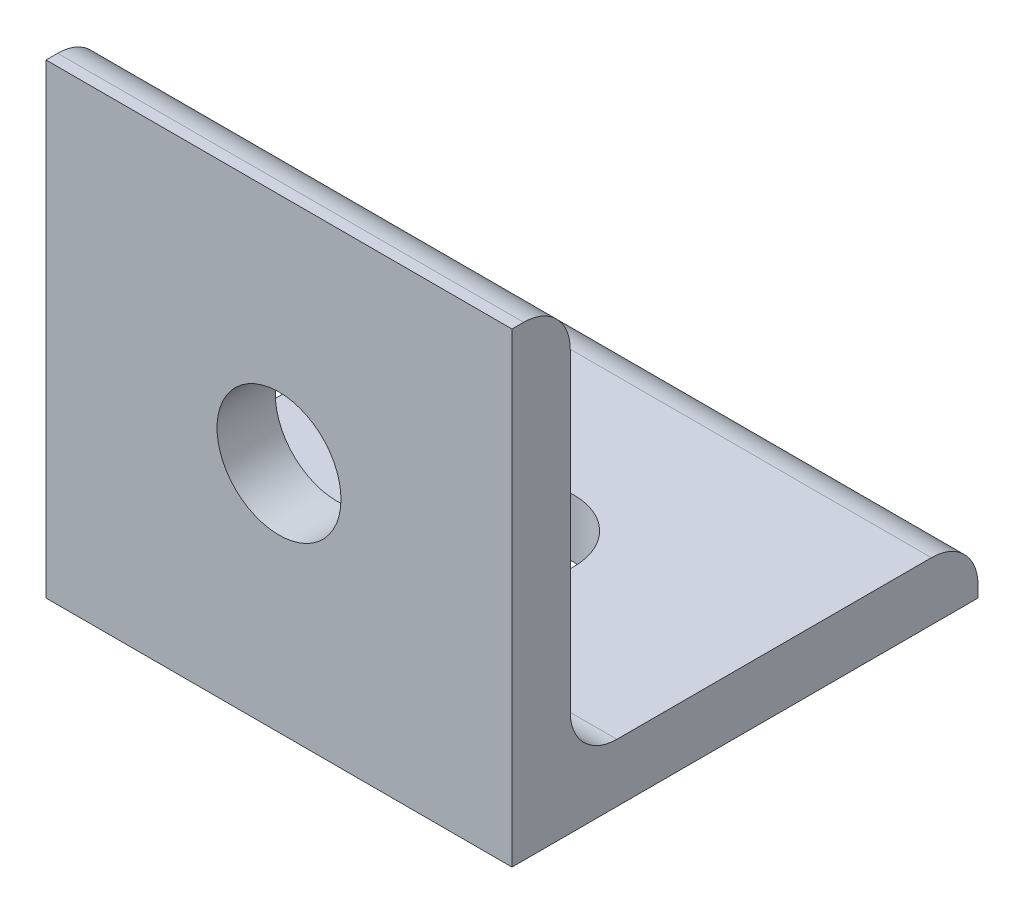
ISO-10303-21;
HEADER;
FILE_DESCRIPTION(('STEP AP214'),'2;1');
FILE_NAME('part.step','',(''),(''),'','','');
FILE_SCHEMA(('AUTOMOTIVE_DESIGN { 1 0 10303 214 1 1 1 1 }'));
ENDSEC;
DATA;
#1=APPLICATION_CONTEXT('core data for automotive mechanical design processes');
#2=APPLICATION_PROTOCOL_DEFINITION('international standard','automotive_design',2000,#1);
#3=PRODUCT_CONTEXT('',#1,'mechanical');
#4=PRODUCT('Part','Part','',(#3));
#5=PRODUCT_RELATED_PRODUCT_CATEGORY('part','',(#4));
#6=PRODUCT_DEFINITION_FORMATION('','',#4);
#7=PRODUCT_DEFINITION_CONTEXT('part definition',#1,'design');
#8=PRODUCT_DEFINITION('design','',#6,#7);
#9=PRODUCT_DEFINITION_SHAPE('','',#8);
#10=(LENGTH_UNIT() NAMED_UNIT(*) SI_UNIT(.MILLI.,.METRE.));
#11=(NAMED_UNIT(*) PLANE_ANGLE_UNIT() SI_UNIT($,.RADIAN.));
#12=(NAMED_UNIT(*) SI_UNIT($,.STERADIAN.) SOLID_ANGLE_UNIT());
#13=UNCERTAINTY_MEASURE_WITH_UNIT(LENGTH_MEASURE(1.E-05),#10,'distance_accuracy_value','');
#14=(GEOMETRIC_REPRESENTATION_CONTEXT(3) GLOBAL_UNCERTAINTY_ASSIGNED_CONTEXT((#13)) GLOBAL_UNIT_ASSIGNED_CONTEXT((#10,
#11,#12)) REPRESENTATION_CONTEXT('',''));
#15=CARTESIAN_POINT('',(0.,0.,0.));
#16=DIRECTION('',(0.,0.,1.));
#17=DIRECTION('',(1.,0.,0.));
#18=AXIS2_PLACEMENT_3D('',#15,#16,#17);
#19=CARTESIAN_POINT('',(12.7,0.,-25.4));
#20=DIRECTION('',(0.,1.,0.));
#21=DIRECTION('',(0.,0.,1.));
#22=AXIS2_PLACEMENT_3D('',#19,#20,#21);
#23=PLANE('',#22);
#24=CARTESIAN_POINT('',(0.,0.,-12.7));
#25=DIRECTION('',(0.,-1.,0.));
#26=DIRECTION('',(0.,0.,-1.));
#27=AXIS2_PLACEMENT_3D('',#24,#25,#26);
#28=CIRCLE('',#27,3.37819999999999);
#29=CARTESIAN_POINT('',(0.,0.,-16.0782));
#30=VERTEX_POINT('',#29);
#31=EDGE_CURVE('E240',#30,#30,#28,.T.);
#32=ORIENTED_EDGE('',*,*,#31,.F.);
#33=EDGE_LOOP('',(#32));
#34=FACE_BOUND('',#33,.T.);
#35=DIRECTION('',(0.,0.,-1.));
#36=VECTOR('',#35,1.);
#37=CARTESIAN_POINT('',(-12.7,0.,-25.4));
#38=LINE('',#37,#36);
#39=CARTESIAN_POINT('',(-12.7,0.,0.));
#40=VERTEX_POINT('',#39);
#41=CARTESIAN_POINT('',(-12.7,0.,-25.4));
#42=VERTEX_POINT('',#41);
#43=EDGE_CURVE('E122',#40,#42,#38,.T.);
#44=ORIENTED_EDGE('',*,*,#43,.T.);
#45=DIRECTION('',(-1.,0.,0.));
#46=VECTOR('',#45,1.);
#47=CARTESIAN_POINT('',(12.7,0.,-25.4));
#48=LINE('',#47,#46);
#49=CARTESIAN_POINT('',(12.7,0.,-25.4));
#50=VERTEX_POINT('',#49);
#51=EDGE_CURVE('E106',#50,#42,#48,.T.);
#52=ORIENTED_EDGE('',*,*,#51,.F.);
#53=DIRECTION('',(0.,0.,-1.));
#54=VECTOR('',#53,1.);
#55=CARTESIAN_POINT('',(12.7,0.,-25.4));
#56=LINE('',#55,#54);
#57=CARTESIAN_POINT('',(12.7,0.,0.));
#58=VERTEX_POINT('',#57);
#59=EDGE_CURVE('E110',#58,#50,#56,.T.);
#60=ORIENTED_EDGE('',*,*,#59,.F.);
#61=DIRECTION('',(-1.,0.,0.));
#62=VECTOR('',#61,1.);
#63=CARTESIAN_POINT('',(12.7,0.,0.));
#64=LINE('',#63,#62);
#65=EDGE_CURVE('E129',#58,#40,#64,.T.);
#66=ORIENTED_EDGE('',*,*,#65,.T.);
#67=EDGE_LOOP('',(#44,#52,#60,#66));
#68=FACE_BOUND('',#67,.T.);
#69=ADVANCED_FACE('F32',(#34,#68),#23,.F.);
#70=CARTESIAN_POINT('',(12.7,3.175,-25.4));
#71=DIRECTION('',(0.,0.,1.));
#72=DIRECTION('',(1.,0.,0.));
#73=AXIS2_PLACEMENT_3D('',#70,#71,#72);
#74=PLANE('',#73);
#75=DIRECTION('',(0.,1.,0.));
#76=VECTOR('',#75,1.);
#77=CARTESIAN_POINT('',(-12.7,3.175,-25.4));
#78=LINE('',#77,#76);
#79=CARTESIAN_POINT('',(-12.7,0.634999999999998,-25.4));
#80=VERTEX_POINT('',#79);
#81=EDGE_CURVE('E166',#42,#80,#78,.T.);
#82=ORIENTED_EDGE('',*,*,#81,.T.);
#83=DIRECTION('',(-1.,0.,0.));
#84=VECTOR('',#83,1.);
#85=CARTESIAN_POINT('',(12.7,0.634999999999998,-25.4));
#86=LINE('',#85,#84);
#87=CARTESIAN_POINT('',(12.7,0.634999999999998,-25.4));
#88=VERTEX_POINT('',#87);
#89=EDGE_CURVE('E55',#80,#88,#86,.F.);
#90=ORIENTED_EDGE('',*,*,#89,.T.);
#91=DIRECTION('',(0.,1.,0.));
#92=VECTOR('',#91,1.);
#93=CARTESIAN_POINT('',(12.7,3.175,-25.4));
#94=LINE('',#93,#92);
#95=EDGE_CURVE('E102',#50,#88,#94,.T.);
#96=ORIENTED_EDGE('',*,*,#95,.F.);
#97=ORIENTED_EDGE('',*,*,#51,.T.);
#98=EDGE_LOOP('',(#82,#90,#96,#97));
#99=FACE_BOUND('',#98,.T.);
#100=ADVANCED_FACE('F104',(#99),#74,.F.);
#101=CARTESIAN_POINT('',(12.7,3.175,-3.175));
#102=DIRECTION('',(0.,-1.,0.));
#103=DIRECTION('',(0.,0.,-1.));
#104=AXIS2_PLACEMENT_3D('',#101,#102,#103);
#105=PLANE('',#104);
#106=CARTESIAN_POINT('',(0.,3.175,-12.7));
#107=DIRECTION('',(0.,-1.,0.));
#108=DIRECTION('',(0.,0.,-1.));
#109=AXIS2_PLACEMENT_3D('',#106,#107,#108);
#110=CIRCLE('',#109,3.37819999999999);
#111=CARTESIAN_POINT('',(0.,3.175,-16.0782));
#112=VERTEX_POINT('',#111);
#113=EDGE_CURVE('E238',#112,#112,#110,.T.);
#114=ORIENTED_EDGE('',*,*,#113,.T.);
#115=EDGE_LOOP('',(#114));
#116=FACE_BOUND('',#115,.T.);
#117=DIRECTION('',(0.,0.,1.));
#118=VECTOR('',#117,1.);
#119=CARTESIAN_POINT('',(-12.7,3.175,-3.175));
#120=LINE('',#119,#118);
#121=CARTESIAN_POINT('',(-12.7,3.175,-22.86));
#122=VERTEX_POINT('',#121);
#123=CARTESIAN_POINT('',(-12.7,3.175,-5.715));
#124=VERTEX_POINT('',#123);
#125=EDGE_CURVE('E155',#122,#124,#120,.T.);
#126=ORIENTED_EDGE('',*,*,#125,.T.);
#127=DIRECTION('',(-1.,0.,0.));
#128=VECTOR('',#127,1.);
#129=CARTESIAN_POINT('',(12.7,3.175,-5.715));
#130=LINE('',#129,#128);
#131=CARTESIAN_POINT('',(12.7,3.175,-5.715));
#132=VERTEX_POINT('',#131);
#133=EDGE_CURVE('E138',#124,#132,#130,.F.);
#134=ORIENTED_EDGE('',*,*,#133,.T.);
#135=DIRECTION('',(0.,0.,1.));
#136=VECTOR('',#135,1.);
#137=CARTESIAN_POINT('',(12.7,3.175,-3.175));
#138=LINE('',#137,#136);
#139=CARTESIAN_POINT('',(12.7,3.175,-22.86));
#140=VERTEX_POINT('',#139);
#141=EDGE_CURVE('E109',#140,#132,#138,.T.);
#142=ORIENTED_EDGE('',*,*,#141,.F.);
#143=DIRECTION('',(-1.,0.,0.));
#144=VECTOR('',#143,1.);
#145=CARTESIAN_POINT('',(12.7,3.175,-22.86));
#146=LINE('',#145,#144);
#147=EDGE_CURVE('E135',#140,#122,#146,.T.);
#148=ORIENTED_EDGE('',*,*,#147,.T.);
#149=EDGE_LOOP('',(#126,#134,#142,#148));
#150=FACE_BOUND('',#149,.T.);
#151=ADVANCED_FACE('F162',(#116,#150),#105,.F.);
#152=CARTESIAN_POINT('',(12.7,25.4,-3.175));
#153=DIRECTION('',(0.,0.,1.));
#154=DIRECTION('',(0.,-1.,0.));
#155=AXIS2_PLACEMENT_3D('',#152,#153,#154);
#156=PLANE('',#155);
#157=CARTESIAN_POINT('',(0.,12.7,-3.175));
#158=DIRECTION('',(0.,0.,1.));
#159=DIRECTION('',(0.,-1.,0.));
#160=AXIS2_PLACEMENT_3D('',#157,#158,#159);
#161=CIRCLE('',#160,3.37819999999999);
#162=CARTESIAN_POINT('',(0.,9.3218,-3.175));
#163=VERTEX_POINT('',#162);
#164=EDGE_CURVE('E182',#163,#163,#161,.T.);
#165=ORIENTED_EDGE('',*,*,#164,.T.);
#166=EDGE_LOOP('',(#165));
#167=FACE_BOUND('',#166,.T.);
#168=DIRECTION('',(0.,1.,0.));
#169=VECTOR('',#168,1.);
#170=CARTESIAN_POINT('',(12.7,25.4,-3.175));
#171=LINE('',#170,#169);
#172=CARTESIAN_POINT('',(12.7,5.715,-3.175));
#173=VERTEX_POINT('',#172);
#174=CARTESIAN_POINT('',(12.7,22.86,-3.175));
#175=VERTEX_POINT('',#174);
#176=EDGE_CURVE('E171',#173,#175,#171,.T.);
#177=ORIENTED_EDGE('',*,*,#176,.F.);
#178=DIRECTION('',(-1.,0.,0.));
#179=VECTOR('',#178,1.);
#180=CARTESIAN_POINT('',(-12.7,5.715,-3.175));
#181=LINE('',#180,#179);
#182=CARTESIAN_POINT('',(-12.7,5.715,-3.175));
#183=VERTEX_POINT('',#182);
#184=EDGE_CURVE('E126',#173,#183,#181,.T.);
#185=ORIENTED_EDGE('',*,*,#184,.T.);
#186=DIRECTION('',(0.,1.,0.));
#187=VECTOR('',#186,1.);
#188=CARTESIAN_POINT('',(-12.7,25.4,-3.175));
#189=LINE('',#188,#187);
#190=CARTESIAN_POINT('',(-12.7,22.86,-3.175));
#191=VERTEX_POINT('',#190);
#192=EDGE_CURVE('E157',#183,#191,#189,.T.);
#193=ORIENTED_EDGE('',*,*,#192,.T.);
#194=DIRECTION('',(-1.,0.,0.));
#195=VECTOR('',#194,1.);
#196=CARTESIAN_POINT('',(12.7,22.86,-3.175));
#197=LINE('',#196,#195);
#198=EDGE_CURVE('E123',#191,#175,#197,.F.);
#199=ORIENTED_EDGE('',*,*,#198,.T.);
#200=EDGE_LOOP('',(#177,#185,#193,#199));
#201=FACE_BOUND('',#200,.T.);
#202=ADVANCED_FACE('F173',(#167,#201),#156,.F.);
#203=CARTESIAN_POINT('',(12.7,25.4,0.));
#204=DIRECTION('',(0.,-1.,0.));
#205=DIRECTION('',(0.,0.,-1.));
#206=AXIS2_PLACEMENT_3D('',#203,#204,#205);
#207=PLANE('',#206);
#208=DIRECTION('',(0.,0.,1.));
#209=VECTOR('',#208,1.);
#210=CARTESIAN_POINT('',(12.7,25.4,0.));
#211=LINE('',#210,#209);
#212=CARTESIAN_POINT('',(12.7,25.4,-0.635));
#213=VERTEX_POINT('',#212);
#214=CARTESIAN_POINT('',(12.7,25.4,0.));
#215=VERTEX_POINT('',#214);
#216=EDGE_CURVE('E175',#213,#215,#211,.T.);
#217=ORIENTED_EDGE('',*,*,#216,.F.);
#218=DIRECTION('',(-1.,0.,0.));
#219=VECTOR('',#218,1.);
#220=CARTESIAN_POINT('',(12.7,25.4,-0.635));
#221=LINE('',#220,#219);
#222=CARTESIAN_POINT('',(-12.7,25.4,-0.635));
#223=VERTEX_POINT('',#222);
#224=EDGE_CURVE('E148',#213,#223,#221,.T.);
#225=ORIENTED_EDGE('',*,*,#224,.T.);
#226=DIRECTION('',(0.,0.,1.));
#227=VECTOR('',#226,1.);
#228=CARTESIAN_POINT('',(-12.7,25.4,0.));
#229=LINE('',#228,#227);
#230=CARTESIAN_POINT('',(-12.7,25.4,0.));
#231=VERTEX_POINT('',#230);
#232=EDGE_CURVE('E185',#223,#231,#229,.T.);
#233=ORIENTED_EDGE('',*,*,#232,.T.);
#234=DIRECTION('',(-1.,0.,0.));
#235=VECTOR('',#234,1.);
#236=CARTESIAN_POINT('',(12.7,25.4,0.));
#237=LINE('',#236,#235);
#238=EDGE_CURVE('E124',#215,#231,#237,.T.);
#239=ORIENTED_EDGE('',*,*,#238,.F.);
#240=EDGE_LOOP('',(#217,#225,#233,#239));
#241=FACE_BOUND('',#240,.T.);
#242=ADVANCED_FACE('F214',(#241),#207,.F.);
#243=CARTESIAN_POINT('',(12.7,0.,0.));
#244=DIRECTION('',(0.,0.,-1.));
#245=DIRECTION('',(-1.,0.,0.));
#246=AXIS2_PLACEMENT_3D('',#243,#244,#245);
#247=PLANE('',#246);
#248=CARTESIAN_POINT('',(0.,12.7,0.));
#249=DIRECTION('',(0.,0.,1.));
#250=DIRECTION('',(1.,0.,0.));
#251=AXIS2_PLACEMENT_3D('',#248,#249,#250);
#252=CIRCLE('',#251,3.37819999999999);
#253=CARTESIAN_POINT('',(3.37819999999999,12.7,0.));
#254=VERTEX_POINT('',#253);
#255=EDGE_CURVE('E242',#254,#254,#252,.T.);
#256=ORIENTED_EDGE('',*,*,#255,.F.);
#257=EDGE_LOOP('',(#256));
#258=FACE_BOUND('',#257,.T.);
#259=DIRECTION('',(0.,-1.,0.));
#260=VECTOR('',#259,1.);
#261=CARTESIAN_POINT('',(-12.7,0.,0.));
#262=LINE('',#261,#260);
#263=EDGE_CURVE('E119',#231,#40,#262,.T.);
#264=ORIENTED_EDGE('',*,*,#263,.T.);
#265=ORIENTED_EDGE('',*,*,#65,.F.);
#266=DIRECTION('',(0.,-1.,0.));
#267=VECTOR('',#266,1.);
#268=CARTESIAN_POINT('',(12.7,0.,0.));
#269=LINE('',#268,#267);
#270=EDGE_CURVE('E115',#215,#58,#269,.T.);
#271=ORIENTED_EDGE('',*,*,#270,.F.);
#272=ORIENTED_EDGE('',*,*,#238,.T.);
#273=EDGE_LOOP('',(#264,#265,#271,#272));
#274=FACE_BOUND('',#273,.T.);
#275=ADVANCED_FACE('F218',(#258,#274),#247,.F.);
#276=CARTESIAN_POINT('',(12.7,0.,0.));
#277=DIRECTION('',(-1.,0.,0.));
#278=DIRECTION('',(0.,0.,1.));
#279=AXIS2_PLACEMENT_3D('',#276,#277,#278);
#280=PLANE('',#279);
#281=ORIENTED_EDGE('',*,*,#95,.T.);
#282=CARTESIAN_POINT('',(12.7,0.634999999999998,-22.86));
#283=DIRECTION('',(-1.,0.,0.));
#284=DIRECTION('',(0.,0.,1.));
#285=AXIS2_PLACEMENT_3D('',#282,#283,#284);
#286=CIRCLE('',#285,2.54);
#287=EDGE_CURVE('E146',#88,#140,#286,.F.);
#288=ORIENTED_EDGE('',*,*,#287,.T.);
#289=ORIENTED_EDGE('',*,*,#141,.T.);
#290=CARTESIAN_POINT('',(12.7,5.715,-5.715));
#291=DIRECTION('',(-1.,0.,0.));
#292=DIRECTION('',(0.,0.,1.));
#293=AXIS2_PLACEMENT_3D('',#290,#291,#292);
#294=CIRCLE('',#293,2.54);
#295=EDGE_CURVE('E11',#132,#173,#294,.T.);
#296=ORIENTED_EDGE('',*,*,#295,.T.);
#297=ORIENTED_EDGE('',*,*,#176,.T.);
#298=CARTESIAN_POINT('',(12.7,22.86,-0.635));
#299=DIRECTION('',(-1.,0.,0.));
#300=DIRECTION('',(0.,0.,1.));
#301=AXIS2_PLACEMENT_3D('',#298,#299,#300);
#302=CIRCLE('',#301,2.54);
#303=EDGE_CURVE('E47',#175,#213,#302,.F.);
#304=ORIENTED_EDGE('',*,*,#303,.T.);
#305=ORIENTED_EDGE('',*,*,#216,.T.);
#306=ORIENTED_EDGE('',*,*,#270,.T.);
#307=ORIENTED_EDGE('',*,*,#59,.T.);
#308=EDGE_LOOP('',(#281,#288,#289,#296,#297,#304,#305,#306,#307));
#309=FACE_BOUND('',#308,.T.);
#310=ADVANCED_FACE('F113',(#309),#280,.F.);
#311=CARTESIAN_POINT('',(-12.7,0.,0.));
#312=DIRECTION('',(-1.,0.,0.));
#313=DIRECTION('',(0.,0.,1.));
#314=AXIS2_PLACEMENT_3D('',#311,#312,#313);
#315=PLANE('',#314);
#316=ORIENTED_EDGE('',*,*,#125,.F.);
#317=CARTESIAN_POINT('',(-12.7,0.634999999999998,-22.86));
#318=DIRECTION('',(-1.,0.,0.));
#319=DIRECTION('',(0.,0.,1.));
#320=AXIS2_PLACEMENT_3D('',#317,#318,#319);
#321=CIRCLE('',#320,2.54);
#322=EDGE_CURVE('E142',#122,#80,#321,.T.);
#323=ORIENTED_EDGE('',*,*,#322,.T.);
#324=ORIENTED_EDGE('',*,*,#81,.F.);
#325=ORIENTED_EDGE('',*,*,#43,.F.);
#326=ORIENTED_EDGE('',*,*,#263,.F.);
#327=ORIENTED_EDGE('',*,*,#232,.F.);
#328=CARTESIAN_POINT('',(-12.7,22.86,-0.635));
#329=DIRECTION('',(-1.,0.,0.));
#330=DIRECTION('',(0.,0.,1.));
#331=AXIS2_PLACEMENT_3D('',#328,#329,#330);
#332=CIRCLE('',#331,2.54);
#333=EDGE_CURVE('E140',#223,#191,#332,.T.);
#334=ORIENTED_EDGE('',*,*,#333,.T.);
#335=ORIENTED_EDGE('',*,*,#192,.F.);
#336=CARTESIAN_POINT('',(-12.7,5.715,-5.715));
#337=DIRECTION('',(-1.,0.,0.));
#338=DIRECTION('',(0.,0.,1.));
#339=AXIS2_PLACEMENT_3D('',#336,#337,#338);
#340=CIRCLE('',#339,2.54);
#341=EDGE_CURVE('E40',#183,#124,#340,.F.);
#342=ORIENTED_EDGE('',*,*,#341,.T.);
#343=EDGE_LOOP('',(#316,#323,#324,#325,#326,#327,#334,#335,#342));
#344=FACE_BOUND('',#343,.T.);
#345=ADVANCED_FACE('F154',(#344),#315,.T.);
#346=CARTESIAN_POINT('',(0.,12.7,0.));
#347=DIRECTION('',(0.,0.,1.));
#348=DIRECTION('',(1.,0.,0.));
#349=AXIS2_PLACEMENT_3D('',#346,#347,#348);
#350=CYLINDRICAL_SURFACE('',#349,3.37819999999999);
#351=ORIENTED_EDGE('',*,*,#164,.F.);
#352=EDGE_LOOP('',(#351));
#353=FACE_BOUND('',#352,.T.);
#354=ORIENTED_EDGE('',*,*,#255,.T.);
#355=EDGE_LOOP('',(#354));
#356=FACE_BOUND('',#355,.T.);
#357=ADVANCED_FACE('F225',(#353,#356),#350,.F.);
#358=CARTESIAN_POINT('',(0.,0.,-12.7));
#359=DIRECTION('',(0.,-1.,0.));
#360=DIRECTION('',(0.,0.,-1.));
#361=AXIS2_PLACEMENT_3D('',#358,#359,#360);
#362=CYLINDRICAL_SURFACE('',#361,3.37819999999999);
#363=ORIENTED_EDGE('',*,*,#113,.F.);
#364=EDGE_LOOP('',(#363));
#365=FACE_BOUND('',#364,.T.);
#366=ORIENTED_EDGE('',*,*,#31,.T.);
#367=EDGE_LOOP('',(#366));
#368=FACE_BOUND('',#367,.T.);
#369=ADVANCED_FACE('F198',(#365,#368),#362,.F.);
#370=CARTESIAN_POINT('',(12.7,5.715,-5.715));
#371=DIRECTION('',(1.,0.,0.));
#372=DIRECTION('',(0.,0.,-1.));
#373=AXIS2_PLACEMENT_3D('',#370,#371,#372);
#374=CYLINDRICAL_SURFACE('',#373,2.54);
#375=ORIENTED_EDGE('',*,*,#295,.F.);
#376=ORIENTED_EDGE('',*,*,#133,.F.);
#377=ORIENTED_EDGE('',*,*,#341,.F.);
#378=ORIENTED_EDGE('',*,*,#184,.F.);
#379=EDGE_LOOP('',(#375,#376,#377,#378));
#380=FACE_BOUND('',#379,.T.);
#381=ADVANCED_FACE('F169',(#380),#374,.F.);
#382=CARTESIAN_POINT('',(12.7,0.634999999999998,-22.86));
#383=DIRECTION('',(-1.,0.,0.));
#384=DIRECTION('',(0.,0.,1.));
#385=AXIS2_PLACEMENT_3D('',#382,#383,#384);
#386=CYLINDRICAL_SURFACE('',#385,2.54);
#387=ORIENTED_EDGE('',*,*,#287,.F.);
#388=ORIENTED_EDGE('',*,*,#89,.F.);
#389=ORIENTED_EDGE('',*,*,#322,.F.);
#390=ORIENTED_EDGE('',*,*,#147,.F.);
#391=EDGE_LOOP('',(#387,#388,#389,#390));
#392=FACE_BOUND('',#391,.T.);
#393=ADVANCED_FACE('F191',(#392),#386,.T.);
#394=CARTESIAN_POINT('',(12.7,22.86,-0.635));
#395=DIRECTION('',(-1.,0.,0.));
#396=DIRECTION('',(0.,0.,1.));
#397=AXIS2_PLACEMENT_3D('',#394,#395,#396);
#398=CYLINDRICAL_SURFACE('',#397,2.54);
#399=ORIENTED_EDGE('',*,*,#303,.F.);
#400=ORIENTED_EDGE('',*,*,#198,.F.);
#401=ORIENTED_EDGE('',*,*,#333,.F.);
#402=ORIENTED_EDGE('',*,*,#224,.F.);
#403=EDGE_LOOP('',(#399,#400,#401,#402));
#404=FACE_BOUND('',#403,.T.);
#405=ADVANCED_FACE('F34',(#404),#398,.T.);
#406=CLOSED_SHELL('',(#69,#100,#151,#202,#242,#275,#310,#345,#357,#369,#381,#393,#405));
#407=MANIFOLD_SOLID_BREP('B2',#406);
#408=ADVANCED_BREP_SHAPE_REPRESENTATION('',(#18,#407),#14);
#409=SHAPE_DEFINITION_REPRESENTATION(#9,#408);
ENDSEC;
END-ISO-10303-21;
